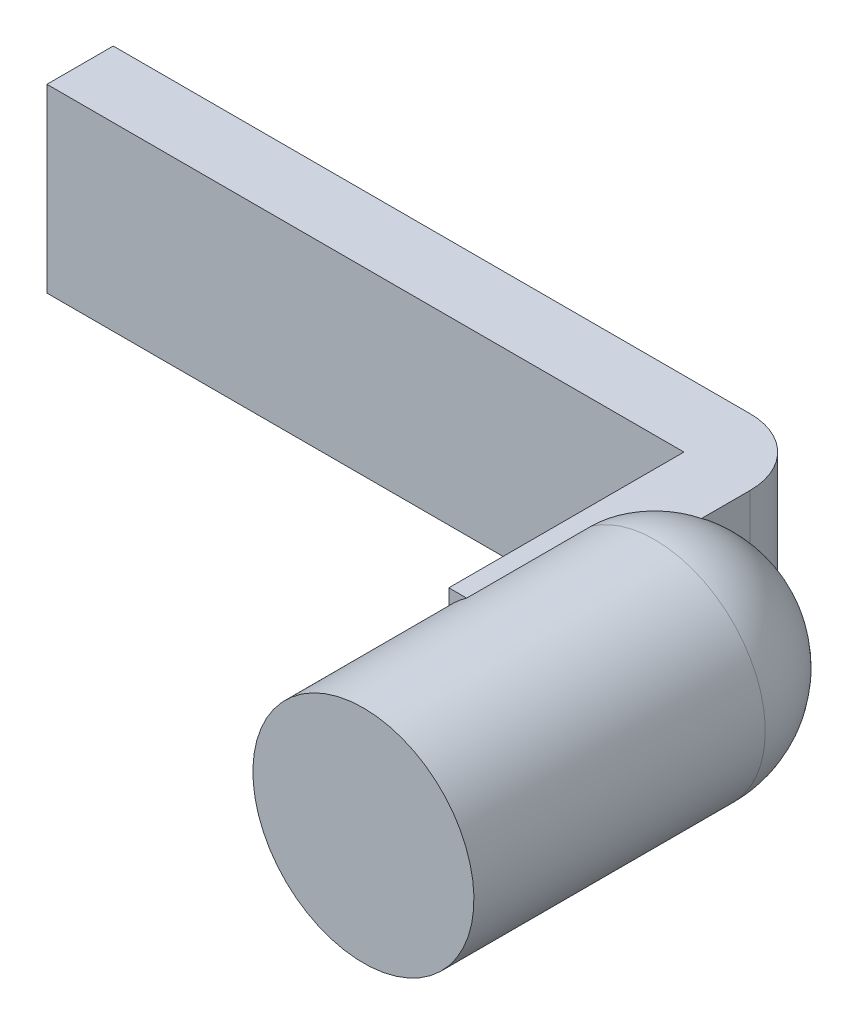
ISO-10303-21;
HEADER;
FILE_DESCRIPTION(('STEP AP214'),'2;1');
FILE_NAME('part.step','',(''),(''),'','','');
FILE_SCHEMA(('AUTOMOTIVE_DESIGN { 1 0 10303 214 1 1 1 1 }'));
ENDSEC;
DATA;
#1=APPLICATION_CONTEXT('core data for automotive mechanical design processes');
#2=APPLICATION_PROTOCOL_DEFINITION('international standard','automotive_design',2000,#1);
#3=PRODUCT_CONTEXT('',#1,'mechanical');
#4=PRODUCT('Part','Part','',(#3));
#5=PRODUCT_RELATED_PRODUCT_CATEGORY('part','',(#4));
#6=PRODUCT_DEFINITION_FORMATION('','',#4);
#7=PRODUCT_DEFINITION_CONTEXT('part definition',#1,'design');
#8=PRODUCT_DEFINITION('design','',#6,#7);
#9=PRODUCT_DEFINITION_SHAPE('','',#8);
#10=(LENGTH_UNIT() NAMED_UNIT(*) SI_UNIT(.MILLI.,.METRE.));
#11=(NAMED_UNIT(*) PLANE_ANGLE_UNIT() SI_UNIT($,.RADIAN.));
#12=(NAMED_UNIT(*) SI_UNIT($,.STERADIAN.) SOLID_ANGLE_UNIT());
#13=UNCERTAINTY_MEASURE_WITH_UNIT(LENGTH_MEASURE(1.E-05),#10,'distance_accuracy_value','');
#14=(GEOMETRIC_REPRESENTATION_CONTEXT(3) GLOBAL_UNCERTAINTY_ASSIGNED_CONTEXT((#13)) GLOBAL_UNIT_ASSIGNED_CONTEXT((#10,
#11,#12)) REPRESENTATION_CONTEXT('',''));
#15=CARTESIAN_POINT('',(0.,0.,0.));
#16=DIRECTION('',(0.,0.,1.));
#17=DIRECTION('',(1.,0.,0.));
#18=AXIS2_PLACEMENT_3D('',#15,#16,#17);
#19=CARTESIAN_POINT('',(-2.275,0.,0.705));
#20=DIRECTION('',(0.,0.,-1.));
#21=DIRECTION('',(0.,1.,0.));
#22=AXIS2_PLACEMENT_3D('',#19,#20,#21);
#23=CYLINDRICAL_SURFACE('',#22,0.55);
#24=CARTESIAN_POINT('',(-2.275,0.,1.43));
#25=DIRECTION('',(0.,0.,-1.));
#26=DIRECTION('',(0.,1.,0.));
#27=AXIS2_PLACEMENT_3D('',#24,#25,#26);
#28=CIRCLE('',#27,0.55);
#29=CARTESIAN_POINT('',(-2.275,0.55,1.43));
#30=VERTEX_POINT('',#29);
#31=EDGE_CURVE('E30',#30,#30,#28,.T.);
#32=ORIENTED_EDGE('',*,*,#31,.T.);
#33=CARTESIAN_POINT('',(-2.275,0.55,1.43));
#34=CARTESIAN_POINT('',(-2.275,0.55,-0.02000000000001));
#35=(BOUNDED_CURVE() B_SPLINE_CURVE(1,(#33,#34),.UNSPECIFIED.,.F.,
.F.) B_SPLINE_CURVE_WITH_KNOTS((2,2),(-0.725,0.725),
.UNSPECIFIED.) CURVE() GEOMETRIC_REPRESENTATION_ITEM() RATIONAL_B_SPLINE_CURVE((1.,1.)) REPRESENTATION_ITEM(''));
#36=CARTESIAN_POINT('',(-2.275,0.55,-0.02000000000001));
#37=VERTEX_POINT('',#36);
#38=EDGE_CURVE('E11',#30,#37,#35,.T.);
#39=ORIENTED_EDGE('',*,*,#38,.T.);
#40=CARTESIAN_POINT('',(-2.275,0.,-0.02));
#41=DIRECTION('',(0.,0.,1.));
#42=DIRECTION('',(0.,1.,0.));
#43=AXIS2_PLACEMENT_3D('',#40,#41,#42);
#44=CIRCLE('',#43,0.55);
#45=CARTESIAN_POINT('',(-2.591227766017,0.45,-0.02000000000001));
#46=VERTEX_POINT('',#45);
#47=EDGE_CURVE('E67',#37,#46,#44,.T.);
#48=ORIENTED_EDGE('',*,*,#47,.T.);
#49=DIRECTION('',(0.,0.,-1.));
#50=VECTOR('',#49,1.);
#51=CARTESIAN_POINT('',(-2.591227766017,0.45,-0.52089));
#52=LINE('',#51,#50);
#53=CARTESIAN_POINT('',(-2.591227766017,0.45,0.6));
#54=VERTEX_POINT('',#53);
#55=EDGE_CURVE('E253',#54,#46,#52,.T.);
#56=ORIENTED_EDGE('',*,*,#55,.F.);
#57=CARTESIAN_POINT('',(-2.275,0.,0.6));
#58=DIRECTION('',(0.,0.,1.));
#59=DIRECTION('',(0.,1.,0.));
#60=AXIS2_PLACEMENT_3D('',#57,#58,#59);
#61=CIRCLE('',#60,0.55);
#62=CARTESIAN_POINT('',(-2.68,0.372122291727,0.6));
#63=VERTEX_POINT('',#62);
#64=EDGE_CURVE('E220',#54,#63,#61,.T.);
#65=ORIENTED_EDGE('',*,*,#64,.T.);
#66=DIRECTION('',(0.,0.,-1.));
#67=VECTOR('',#66,1.);
#68=CARTESIAN_POINT('',(-2.68,0.372122291727,0.705));
#69=LINE('',#68,#67);
#70=CARTESIAN_POINT('',(-2.68,0.372122291727,-0.02000000000001));
#71=VERTEX_POINT('',#70);
#72=EDGE_CURVE('E229',#63,#71,#69,.T.);
#73=ORIENTED_EDGE('',*,*,#72,.T.);
#74=CARTESIAN_POINT('',(-2.275,0.,-0.02));
#75=DIRECTION('',(0.,0.,1.));
#76=DIRECTION('',(0.,1.,0.));
#77=AXIS2_PLACEMENT_3D('',#74,#75,#76);
#78=CIRCLE('',#77,0.55);
#79=CARTESIAN_POINT('',(-2.68,-0.372122291727,-0.02));
#80=VERTEX_POINT('',#79);
#81=EDGE_CURVE('E224',#71,#80,#78,.T.);
#82=ORIENTED_EDGE('',*,*,#81,.T.);
#83=DIRECTION('',(0.,0.,1.));
#84=VECTOR('',#83,1.);
#85=CARTESIAN_POINT('',(-2.68,-0.372122291727,0.705));
#86=LINE('',#85,#84);
#87=CARTESIAN_POINT('',(-2.68,-0.372122291727,0.6));
#88=VERTEX_POINT('',#87);
#89=EDGE_CURVE('E225',#80,#88,#86,.T.);
#90=ORIENTED_EDGE('',*,*,#89,.T.);
#91=CARTESIAN_POINT('',(-2.275,0.,0.6));
#92=DIRECTION('',(0.,0.,1.));
#93=DIRECTION('',(0.,1.,0.));
#94=AXIS2_PLACEMENT_3D('',#91,#92,#93);
#95=CIRCLE('',#94,0.55);
#96=CARTESIAN_POINT('',(-2.591227766017,-0.45,0.6));
#97=VERTEX_POINT('',#96);
#98=EDGE_CURVE('E233',#88,#97,#95,.T.);
#99=ORIENTED_EDGE('',*,*,#98,.T.);
#100=DIRECTION('',(0.,0.,-1.));
#101=VECTOR('',#100,1.);
#102=CARTESIAN_POINT('',(-2.591227766017,-0.45,0.705));
#103=LINE('',#102,#101);
#104=CARTESIAN_POINT('',(-2.591227766017,-0.45,-0.02));
#105=VERTEX_POINT('',#104);
#106=EDGE_CURVE('E254',#97,#105,#103,.T.);
#107=ORIENTED_EDGE('',*,*,#106,.T.);
#108=CARTESIAN_POINT('',(-2.275,0.,-0.02));
#109=DIRECTION('',(0.,0.,-1.));
#110=DIRECTION('',(0.,1.,0.));
#111=AXIS2_PLACEMENT_3D('',#108,#109,#110);
#112=CIRCLE('',#111,0.55);
#113=CARTESIAN_POINT('',(-2.275,-0.55,-0.02));
#114=VERTEX_POINT('',#113);
#115=EDGE_CURVE('E150',#114,#105,#112,.T.);
#116=ORIENTED_EDGE('',*,*,#115,.F.);
#117=CARTESIAN_POINT('',(-2.275,0.,-0.02));
#118=DIRECTION('',(0.,0.,1.));
#119=DIRECTION('',(0.,1.,0.));
#120=AXIS2_PLACEMENT_3D('',#117,#118,#119);
#121=CIRCLE('',#120,0.55);
#122=EDGE_CURVE('E199',#114,#37,#121,.T.);
#123=ORIENTED_EDGE('',*,*,#122,.T.);
#124=ORIENTED_EDGE('',*,*,#38,.F.);
#125=EDGE_LOOP('',(#32,#39,#48,#56,#65,#73,#82,#90,#99,#107,#116,#123,#124));
#126=FACE_BOUND('',#125,.T.);
#127=ADVANCED_FACE('F17',(#126),#23,.T.);
#128=CARTESIAN_POINT('',(-1.725,0.,1.43));
#129=DIRECTION('',(0.,0.,1.));
#130=DIRECTION('',(0.,-1.,0.));
#131=AXIS2_PLACEMENT_3D('',#128,#129,#130);
#132=PLANE('',#131);
#133=ORIENTED_EDGE('',*,*,#31,.F.);
#134=EDGE_LOOP('',(#133));
#135=FACE_BOUND('',#134,.T.);
#136=ADVANCED_FACE('F272',(#135),#132,.T.);
#137=CARTESIAN_POINT('',(-2.35,0.,0.6));
#138=DIRECTION('',(0.,0.,1.));
#139=DIRECTION('',(0.,-1.,0.));
#140=AXIS2_PLACEMENT_3D('',#137,#138,#139);
#141=PLANE('',#140);
#142=DIRECTION('',(0.,-1.,0.));
#143=VECTOR('',#142,1.);
#144=CARTESIAN_POINT('',(-2.68,0.,0.6));
#145=LINE('',#144,#143);
#146=CARTESIAN_POINT('',(-2.68,-0.45,0.6));
#147=VERTEX_POINT('',#146);
#148=EDGE_CURVE('E142',#88,#147,#145,.T.);
#149=ORIENTED_EDGE('',*,*,#148,.T.);
#150=DIRECTION('',(1.,0.,0.));
#151=VECTOR('',#150,1.);
#152=CARTESIAN_POINT('',(-2.35,-0.45,0.6));
#153=LINE('',#152,#151);
#154=EDGE_CURVE('E207',#147,#97,#153,.T.);
#155=ORIENTED_EDGE('',*,*,#154,.T.);
#156=ORIENTED_EDGE('',*,*,#98,.F.);
#157=EDGE_LOOP('',(#149,#155,#156));
#158=FACE_BOUND('',#157,.T.);
#159=ADVANCED_FACE('F275',(#158),#141,.T.);
#160=CARTESIAN_POINT('',(-2.68,0.,0.6));
#161=DIRECTION('',(-1.,0.,0.));
#162=DIRECTION('',(0.,1.,0.));
#163=AXIS2_PLACEMENT_3D('',#160,#161,#162);
#164=PLANE('',#163);
#165=DIRECTION('',(0.,0.,1.));
#166=VECTOR('',#165,1.);
#167=CARTESIAN_POINT('',(-2.68,-0.45,0.6));
#168=LINE('',#167,#166);
#169=CARTESIAN_POINT('',(-2.68,-0.45,-0.57));
#170=VERTEX_POINT('',#169);
#171=EDGE_CURVE('E204',#170,#147,#168,.T.);
#172=ORIENTED_EDGE('',*,*,#171,.T.);
#173=ORIENTED_EDGE('',*,*,#148,.F.);
#174=ORIENTED_EDGE('',*,*,#89,.F.);
#175=CARTESIAN_POINT('',(-2.68,-0.372122291727,-0.02));
#176=CARTESIAN_POINT('',(-2.68,-0.372122291727,-0.04112449996238));
#177=CARTESIAN_POINT('',(-2.68,-0.37033672664,-0.06194491303894));
#178=CARTESIAN_POINT('',(-2.68,-0.363344399046,-0.103003099401));
#179=CARTESIAN_POINT('',(-2.68,-0.358137636539,-0.123240872687));
#180=CARTESIAN_POINT('',(-2.68,-0.344152981351,-0.163108245486));
#181=CARTESIAN_POINT('',(-2.68,-0.335576397589,-0.182163954717));
#182=CARTESIAN_POINT('',(-2.68,-0.315387746701,-0.218593142024));
#183=CARTESIAN_POINT('',(-2.68,-0.303775679576,-0.2359666201));
#184=CARTESIAN_POINT('',(-2.68,-0.277383032988,-0.268957621914));
#185=CARTESIAN_POINT('',(-2.68,-0.26298237531,-0.284100240637));
#186=CARTESIAN_POINT('',(-2.68,-0.231873518371,-0.311793314362));
#187=CARTESIAN_POINT('',(-2.68,-0.215165319109,-0.324343769365));
#188=CARTESIAN_POINT('',(-2.68,-0.179340251817,-0.346738915002));
#189=CARTESIAN_POINT('',(-2.68,-0.160739085137,-0.356261227824));
#190=CARTESIAN_POINT('',(-2.68,-0.122217309781,-0.372096003979));
#191=CARTESIAN_POINT('',(-2.68,-0.102296701106,-0.378408467313));
#192=CARTESIAN_POINT('',(-2.68,-0.06107821768609,-0.387682873986));
#193=CARTESIAN_POINT('',(-2.68,-0.04037368244261,-0.39051131237));
#194=CARTESIAN_POINT('',(-2.68,0.001217973374873,-0.392702540062));
#195=CARTESIAN_POINT('',(-2.68,0.02210509394888,-0.392065329371));
#196=CARTESIAN_POINT('',(-2.68,0.06406992216426,-0.387173378082));
#197=CARTESIAN_POINT('',(-2.68,0.08454354668184,-0.382989057056));
#198=CARTESIAN_POINT('',(-2.68,0.124515939272,-0.371289691986));
#199=CARTESIAN_POINT('',(-2.68,0.144014707345,-0.363774647941));
#200=CARTESIAN_POINT('',(-2.68,0.18199466431,-0.345267869089));
#201=CARTESIAN_POINT('',(-2.68,0.199929132245,-0.334542539107));
#202=CARTESIAN_POINT('',(-2.68,0.233775677564,-0.310271595936));
#203=CARTESIAN_POINT('',(-2.68,0.249687754948,-0.296725982748));
#204=CARTESIAN_POINT('',(-2.68,0.279400888622,-0.266690875259));
#205=CARTESIAN_POINT('',(-2.68,0.292774224762,-0.250633735918));
#206=CARTESIAN_POINT('',(-2.68,0.316678981577,-0.216527579376));
#207=CARTESIAN_POINT('',(-2.68,0.327210402253,-0.198478562176));
#208=CARTESIAN_POINT('',(-2.68,0.34530678221,-0.160301356581));
#209=CARTESIAN_POINT('',(-2.68,0.352611244351,-0.140722728535));
#210=CARTESIAN_POINT('',(-2.68,0.363879132668,-0.100626569052));
#211=CARTESIAN_POINT('',(-2.68,0.367842558842,-0.08010903761419));
#212=CARTESIAN_POINT('',(-2.68,0.370748935362,-0.05260265602304));
#213=CARTESIAN_POINT('',(-2.68,0.371263587125,-0.04609476802498));
#214=CARTESIAN_POINT('',(-2.68,0.371950265307,-0.03306094104902));
#215=CARTESIAN_POINT('',(-2.68,0.372122291727,-0.02653500207113));
#216=CARTESIAN_POINT('',(-2.68,0.372122291727,-0.02000000000001));
#217=(BOUNDED_CURVE() B_SPLINE_CURVE(3,(#175,#176,#177,#178,#179,#180,#181,#182,#183,#184,#185,
#186,#187,#188,#189,#190,#191,#192,#193,#194,#195,#196,#197,#198,#199,#200,#201,#202,#203,#204,
#205,#206,#207,#208,#209,#210,#211,#212,#213,#214,#215,#216),.UNSPECIFIED.,.F.,
.F.) B_SPLINE_CURVE_WITH_KNOTS((4,2,2,2,2,2,2,2,2,2,2,2,2,2,2,2,2,2,2,2,4),(0.,0.06247400621997,
0.12494801244,0.18742201866,0.24989602488,0.312370031098,0.374844037317,0.437318043536,
0.499792049754,0.562266055973,0.624740062191,0.68721406841,0.749688074628,0.812162080847,
0.874636087065,0.937110093284,0.999584099502,1.062058105721,1.124532111939,1.14385885391,
1.163185595881),
.UNSPECIFIED.) CURVE() GEOMETRIC_REPRESENTATION_ITEM() RATIONAL_B_SPLINE_CURVE((1.,1.,1.,1.,1.,
1.,1.,1.,1.,1.,1.,1.,1.,1.,1.,1.,1.,1.,1.,1.,1.,1.,1.,1.,1.,1.,1.,1.,1.,1.,1.,1.,1.,1.,1.,1.,1.,
1.,1.,1.,1.,1.)) REPRESENTATION_ITEM(''));
#218=EDGE_CURVE('E356',#80,#71,#217,.T.);
#219=ORIENTED_EDGE('',*,*,#218,.T.);
#220=ORIENTED_EDGE('',*,*,#72,.F.);
#221=DIRECTION('',(0.,1.,0.));
#222=VECTOR('',#221,1.);
#223=CARTESIAN_POINT('',(-2.68,0.,0.6));
#224=LINE('',#223,#222);
#225=CARTESIAN_POINT('',(-2.68,0.45,0.6));
#226=VERTEX_POINT('',#225);
#227=EDGE_CURVE('E217',#63,#226,#224,.T.);
#228=ORIENTED_EDGE('',*,*,#227,.T.);
#229=DIRECTION('',(0.,0.,1.));
#230=VECTOR('',#229,1.);
#231=CARTESIAN_POINT('',(-2.68,0.45,-0.52089));
#232=LINE('',#231,#230);
#233=CARTESIAN_POINT('',(-2.68,0.45,-0.57));
#234=VERTEX_POINT('',#233);
#235=EDGE_CURVE('E342',#234,#226,#232,.T.);
#236=ORIENTED_EDGE('',*,*,#235,.F.);
#237=DIRECTION('',(0.,1.,0.));
#238=VECTOR('',#237,1.);
#239=CARTESIAN_POINT('',(-2.68,0.,-0.57));
#240=LINE('',#239,#238);
#241=EDGE_CURVE('E210',#170,#234,#240,.T.);
#242=ORIENTED_EDGE('',*,*,#241,.F.);
#243=EDGE_LOOP('',(#172,#173,#174,#219,#220,#228,#236,#242));
#244=FACE_BOUND('',#243,.T.);
#245=ADVANCED_FACE('F270',(#244),#164,.T.);
#246=CARTESIAN_POINT('',(-2.67666557923296,0.375718994009386,-0.0200000000000014));
#247=CARTESIAN_POINT('',(-2.88528379004761,0.152693925217389,-0.0200000000000005));
#248=CARTESIAN_POINT('',(-2.88528379004762,-0.152693925217401,-0.0199999999999995));
#249=CARTESIAN_POINT('',(-2.67666557923299,-0.375718994009417,-0.0199999999999987));
#250=(BOUNDED_CURVE() B_SPLINE_CURVE(3,(#246,#247,#248,#249),.UNSPECIFIED.,.F.,
.F.) B_SPLINE_CURVE_WITH_KNOTS((4,4),(0.,1.),
.UNSPECIFIED.) CURVE() GEOMETRIC_REPRESENTATION_ITEM() RATIONAL_B_SPLINE_CURVE((1.,
0.820200702100579,0.820200702100579,1.)) REPRESENTATION_ITEM(''));
#251=CARTESIAN_POINT('',(-2.275,0.,-0.02));
#252=DIRECTION('',(0.,-1.,0.));
#253=AXIS1_PLACEMENT('',#251,#252);
#254=SURFACE_OF_REVOLUTION('',#250,#253);
#255=ORIENTED_EDGE('',*,*,#81,.F.);
#256=ORIENTED_EDGE('',*,*,#218,.F.);
#257=EDGE_LOOP('',(#255,#256));
#258=FACE_BOUND('',#257,.T.);
#259=ADVANCED_FACE('F266',(#258),#254,.T.);
#260=CARTESIAN_POINT('',(-2.35,0.,0.6));
#261=DIRECTION('',(0.,0.,1.));
#262=DIRECTION('',(0.,-1.,0.));
#263=AXIS2_PLACEMENT_3D('',#260,#261,#262);
#264=PLANE('',#263);
#265=DIRECTION('',(1.,0.,0.));
#266=VECTOR('',#265,1.);
#267=CARTESIAN_POINT('',(-3.72911,0.45,0.6));
#268=LINE('',#267,#266);
#269=EDGE_CURVE('E323',#226,#54,#268,.T.);
#270=ORIENTED_EDGE('',*,*,#269,.F.);
#271=ORIENTED_EDGE('',*,*,#227,.F.);
#272=ORIENTED_EDGE('',*,*,#64,.F.);
#273=EDGE_LOOP('',(#270,#271,#272));
#274=FACE_BOUND('',#273,.T.);
#275=ADVANCED_FACE('F269',(#274),#264,.T.);
#276=CARTESIAN_POINT('',(-2.275,0.549999999999966,-0.020000000000002));
#277=CARTESIAN_POINT('',(-3.375,0.549999999999951,-0.0200000000000019));
#278=CARTESIAN_POINT('',(-3.375,-0.55000000000005,-0.019999999999998));
#279=CARTESIAN_POINT('',(-2.275,-0.550000000000035,-0.0199999999999981));
#280=(BOUNDED_CURVE() B_SPLINE_CURVE(3,(#276,#277,#278,#279),.UNSPECIFIED.,.F.,
.F.) B_SPLINE_CURVE_WITH_KNOTS((4,4),(0.,1.),
.UNSPECIFIED.) CURVE() GEOMETRIC_REPRESENTATION_ITEM() RATIONAL_B_SPLINE_CURVE((1.,
0.333333333333334,0.333333333333334,1.)) REPRESENTATION_ITEM(''));
#281=CARTESIAN_POINT('',(-2.275,0.,-0.02));
#282=DIRECTION('',(0.,-1.,0.));
#283=AXIS1_PLACEMENT('',#281,#282);
#284=SURFACE_OF_REVOLUTION('',#280,#283);
#285=ORIENTED_EDGE('',*,*,#122,.F.);
#286=ORIENTED_EDGE('',*,*,#115,.T.);
#287=CARTESIAN_POINT('',(-2.275,-0.45,-0.02));
#288=DIRECTION('',(0.,-1.,0.));
#289=DIRECTION('',(0.,0.,1.));
#290=AXIS2_PLACEMENT_3D('',#287,#288,#289);
#291=CIRCLE('',#290,0.316227766017);
#292=CARTESIAN_POINT('',(-2.35,-0.45,-0.327205143186));
#293=VERTEX_POINT('',#292);
#294=EDGE_CURVE('E159',#105,#293,#291,.T.);
#295=ORIENTED_EDGE('',*,*,#294,.T.);
#296=CARTESIAN_POINT('',(-2.35,-0.45,-0.327205143186));
#297=CARTESIAN_POINT('',(-2.35,-0.432560692601,-0.352750575949));
#298=CARTESIAN_POINT('',(-2.35,-0.413213175859,-0.376454211292));
#299=CARTESIAN_POINT('',(-2.35,-0.370861954802,-0.420332541684));
#300=CARTESIAN_POINT('',(-2.35,-0.347858250487,-0.440507236734));
#301=CARTESIAN_POINT('',(-2.35,-0.298034423171,-0.477173031994));
#302=CARTESIAN_POINT('',(-2.35,-0.271931513478,-0.493136328587));
#303=CARTESIAN_POINT('',(-2.35,-0.217443709193,-0.520522693575));
#304=CARTESIAN_POINT('',(-2.35,-0.189058814601,-0.53194576197));
#305=CARTESIAN_POINT('',(-2.35,-0.129907033346,-0.550052696687));
#306=CARTESIAN_POINT('',(-2.349999999964,-0.09999163579467,-0.556475914205));
#307=CARTESIAN_POINT('',(-2.349999999964,-0.03951033488424,-0.56428270889));
#308=CARTESIAN_POINT('',(-2.35,-0.008944431523461,-0.565666286042));
#309=CARTESIAN_POINT('',(-2.35,0.05286638904479,-0.56317294068));
#310=CARTESIAN_POINT('',(-2.349999999957,0.08322154045112,-0.559331909902));
#311=CARTESIAN_POINT('',(-2.349999999957,0.142877530104,-0.546678977374));
#312=CARTESIAN_POINT('',(-2.35,0.172178368358,-0.537867075655));
#313=CARTESIAN_POINT('',(-2.35,0.229679527103,-0.515054555991));
#314=CARTESIAN_POINT('',(-2.35,0.257052119137,-0.501382323624));
#315=CARTESIAN_POINT('',(-2.35,0.309157037241,-0.46969618608));
#316=CARTESIAN_POINT('',(-2.35,0.333889363311,-0.451682280903));
#317=CARTESIAN_POINT('',(-2.35,0.374944677623,-0.416031656698));
#318=CARTESIAN_POINT('',(-2.35,0.391510967118,-0.399650813773));
#319=CARTESIAN_POINT('',(-2.35,0.422429733104,-0.364918393771));
#320=CARTESIAN_POINT('',(-2.35,0.436782209594,-0.346566816695));
#321=CARTESIAN_POINT('',(-2.35,0.45,-0.327205143186));
#322=(BOUNDED_CURVE() B_SPLINE_CURVE(3,(#296,#297,#298,#299,#300,#301,#302,#303,#304,#305,#306,
#307,#308,#309,#310,#311,#312,#313,#314,#315,#316,#317,#318,#319,#320,#321),.UNSPECIFIED.,.F.,
.F.) B_SPLINE_CURVE_WITH_KNOTS((4,2,2,2,2,2,2,2,2,2,2,2,4),(0.,0.09147459241185,0.182949184824,
0.274423777236,0.365898369647,0.457372962059,0.548847554471,0.640322146883,0.731796739295,
0.823271331707,0.914745924119,0.984077346649,1.053408769179),
.UNSPECIFIED.) CURVE() GEOMETRIC_REPRESENTATION_ITEM() RATIONAL_B_SPLINE_CURVE((1.,1.,1.,1.,1.,
1.,1.,1.,1.,1.,1.,1.,1.,1.,1.,1.,1.,1.,1.,1.,1.,1.,1.,1.,1.,1.)) REPRESENTATION_ITEM(''));
#323=CARTESIAN_POINT('',(-2.35,0.45,-0.327205143186));
#324=VERTEX_POINT('',#323);
#325=EDGE_CURVE('E80',#293,#324,#322,.T.);
#326=ORIENTED_EDGE('',*,*,#325,.T.);
#327=CARTESIAN_POINT('',(-2.275,0.45,-0.02000000000001));
#328=DIRECTION('',(0.,-1.,0.));
#329=DIRECTION('',(0.,0.,1.));
#330=AXIS2_PLACEMENT_3D('',#327,#328,#329);
#331=CIRCLE('',#330,0.316227766017);
#332=EDGE_CURVE('E216',#46,#324,#331,.T.);
#333=ORIENTED_EDGE('',*,*,#332,.F.);
#334=ORIENTED_EDGE('',*,*,#47,.F.);
#335=EDGE_LOOP('',(#285,#286,#295,#326,#333,#334));
#336=FACE_BOUND('',#335,.T.);
#337=ADVANCED_FACE('F19',(#336),#284,.T.);
#338=CARTESIAN_POINT('',(-3.72911,-0.45,-0.52089));
#339=DIRECTION('',(0.,-1.,0.));
#340=DIRECTION('',(0.,0.,-1.));
#341=AXIS2_PLACEMENT_3D('',#338,#339,#340);
#342=PLANE('',#341);
#343=DIRECTION('',(0.,0.,-1.));
#344=VECTOR('',#343,1.);
#345=CARTESIAN_POINT('',(-5.85,-0.45,-0.52089));
#346=LINE('',#345,#344);
#347=CARTESIAN_POINT('',(-5.85,-0.45,-0.57));
#348=VERTEX_POINT('',#347);
#349=CARTESIAN_POINT('',(-5.85,-0.45,-0.9));
#350=VERTEX_POINT('',#349);
#351=EDGE_CURVE('E172',#348,#350,#346,.T.);
#352=ORIENTED_EDGE('',*,*,#351,.T.);
#353=DIRECTION('',(1.,0.,0.));
#354=VECTOR('',#353,1.);
#355=CARTESIAN_POINT('',(-3.72911,-0.45,-0.9));
#356=LINE('',#355,#354);
#357=CARTESIAN_POINT('',(-2.68,-0.45,-0.9));
#358=VERTEX_POINT('',#357);
#359=EDGE_CURVE('E102',#350,#358,#356,.T.);
#360=ORIENTED_EDGE('',*,*,#359,.T.);
#361=CARTESIAN_POINT('',(-2.68,-0.45,-0.57));
#362=DIRECTION('',(0.,-1.,0.));
#363=DIRECTION('',(1.,0.,0.));
#364=AXIS2_PLACEMENT_3D('',#361,#362,#363);
#365=CIRCLE('',#364,0.33);
#366=CARTESIAN_POINT('',(-2.35,-0.45,-0.57));
#367=VERTEX_POINT('',#366);
#368=EDGE_CURVE('E211',#358,#367,#365,.T.);
#369=ORIENTED_EDGE('',*,*,#368,.T.);
#370=DIRECTION('',(0.,0.,1.));
#371=VECTOR('',#370,1.);
#372=CARTESIAN_POINT('',(-2.35,-0.45,-0.52089));
#373=LINE('',#372,#371);
#374=EDGE_CURVE('E116',#367,#293,#373,.T.);
#375=ORIENTED_EDGE('',*,*,#374,.T.);
#376=ORIENTED_EDGE('',*,*,#294,.F.);
#377=ORIENTED_EDGE('',*,*,#106,.F.);
#378=ORIENTED_EDGE('',*,*,#154,.F.);
#379=ORIENTED_EDGE('',*,*,#171,.F.);
#380=DIRECTION('',(-1.,0.,0.));
#381=VECTOR('',#380,1.);
#382=CARTESIAN_POINT('',(-3.72911,-0.45,-0.57));
#383=LINE('',#382,#381);
#384=EDGE_CURVE('E177',#170,#348,#383,.T.);
#385=ORIENTED_EDGE('',*,*,#384,.T.);
#386=EDGE_LOOP('',(#352,#360,#369,#375,#376,#377,#378,#379,#385));
#387=FACE_BOUND('',#386,.T.);
#388=ADVANCED_FACE('F175',(#387),#342,.T.);
#389=CARTESIAN_POINT('',(-2.35,0.,-0.9));
#390=DIRECTION('',(1.,0.,0.));
#391=DIRECTION('',(0.,1.,0.));
#392=AXIS2_PLACEMENT_3D('',#389,#390,#391);
#393=PLANE('',#392);
#394=ORIENTED_EDGE('',*,*,#325,.F.);
#395=ORIENTED_EDGE('',*,*,#374,.F.);
#396=DIRECTION('',(0.,1.,0.));
#397=VECTOR('',#396,1.);
#398=CARTESIAN_POINT('',(-2.35,0.,-0.57));
#399=LINE('',#398,#397);
#400=CARTESIAN_POINT('',(-2.35,0.45,-0.57));
#401=VERTEX_POINT('',#400);
#402=EDGE_CURVE('E250',#367,#401,#399,.T.);
#403=ORIENTED_EDGE('',*,*,#402,.T.);
#404=DIRECTION('',(0.,0.,-1.));
#405=VECTOR('',#404,1.);
#406=CARTESIAN_POINT('',(-2.35,0.45,-0.52089));
#407=LINE('',#406,#405);
#408=EDGE_CURVE('E212',#324,#401,#407,.T.);
#409=ORIENTED_EDGE('',*,*,#408,.F.);
#410=EDGE_LOOP('',(#394,#395,#403,#409));
#411=FACE_BOUND('',#410,.T.);
#412=ADVANCED_FACE('F279',(#411),#393,.T.);
#413=CARTESIAN_POINT('',(-5.85,0.,-0.9));
#414=DIRECTION('',(0.,0.,-1.));
#415=DIRECTION('',(0.,-1.,0.));
#416=AXIS2_PLACEMENT_3D('',#413,#414,#415);
#417=PLANE('',#416);
#418=DIRECTION('',(0.,1.,0.));
#419=VECTOR('',#418,1.);
#420=CARTESIAN_POINT('',(-5.85,0.,-0.9));
#421=LINE('',#420,#419);
#422=CARTESIAN_POINT('',(-5.85,0.45,-0.9));
#423=VERTEX_POINT('',#422);
#424=EDGE_CURVE('E166',#350,#423,#421,.T.);
#425=ORIENTED_EDGE('',*,*,#424,.T.);
#426=DIRECTION('',(1.,0.,0.));
#427=VECTOR('',#426,1.);
#428=CARTESIAN_POINT('',(-5.85,0.45,-0.9));
#429=LINE('',#428,#427);
#430=CARTESIAN_POINT('',(-2.68,0.45,-0.9));
#431=VERTEX_POINT('',#430);
#432=EDGE_CURVE('E203',#423,#431,#429,.T.);
#433=ORIENTED_EDGE('',*,*,#432,.T.);
#434=DIRECTION('',(0.,-1.,0.));
#435=VECTOR('',#434,1.);
#436=CARTESIAN_POINT('',(-2.68,0.,-0.9));
#437=LINE('',#436,#435);
#438=EDGE_CURVE('E169',#431,#358,#437,.T.);
#439=ORIENTED_EDGE('',*,*,#438,.T.);
#440=ORIENTED_EDGE('',*,*,#359,.F.);
#441=EDGE_LOOP('',(#425,#433,#439,#440));
#442=FACE_BOUND('',#441,.T.);
#443=ADVANCED_FACE('F163',(#442),#417,.T.);
#444=CARTESIAN_POINT('',(-5.85,0.,-0.57));
#445=DIRECTION('',(-1.,0.,0.));
#446=DIRECTION('',(0.,1.,0.));
#447=AXIS2_PLACEMENT_3D('',#444,#445,#446);
#448=PLANE('',#447);
#449=DIRECTION('',(0.,1.,0.));
#450=VECTOR('',#449,1.);
#451=CARTESIAN_POINT('',(-5.85,0.,-0.57));
#452=LINE('',#451,#450);
#453=CARTESIAN_POINT('',(-5.85,0.45,-0.57));
#454=VERTEX_POINT('',#453);
#455=EDGE_CURVE('E192',#348,#454,#452,.T.);
#456=ORIENTED_EDGE('',*,*,#455,.T.);
#457=DIRECTION('',(0.,0.,-1.));
#458=VECTOR('',#457,1.);
#459=CARTESIAN_POINT('',(-5.85,0.45,-0.57));
#460=LINE('',#459,#458);
#461=EDGE_CURVE('E184',#454,#423,#460,.T.);
#462=ORIENTED_EDGE('',*,*,#461,.T.);
#463=ORIENTED_EDGE('',*,*,#424,.F.);
#464=ORIENTED_EDGE('',*,*,#351,.F.);
#465=EDGE_LOOP('',(#456,#462,#463,#464));
#466=FACE_BOUND('',#465,.T.);
#467=ADVANCED_FACE('F182',(#466),#448,.T.);
#468=CARTESIAN_POINT('',(-2.68,0.,-0.57));
#469=DIRECTION('',(0.,0.,1.));
#470=DIRECTION('',(0.,-1.,0.));
#471=AXIS2_PLACEMENT_3D('',#468,#469,#470);
#472=PLANE('',#471);
#473=ORIENTED_EDGE('',*,*,#241,.T.);
#474=DIRECTION('',(-1.,0.,0.));
#475=VECTOR('',#474,1.);
#476=CARTESIAN_POINT('',(-2.68,0.45,-0.57));
#477=LINE('',#476,#475);
#478=EDGE_CURVE('E202',#234,#454,#477,.T.);
#479=ORIENTED_EDGE('',*,*,#478,.T.);
#480=ORIENTED_EDGE('',*,*,#455,.F.);
#481=ORIENTED_EDGE('',*,*,#384,.F.);
#482=EDGE_LOOP('',(#473,#479,#480,#481));
#483=FACE_BOUND('',#482,.T.);
#484=ADVANCED_FACE('F286',(#483),#472,.T.);
#485=CARTESIAN_POINT('',(-2.68,0.,-0.57));
#486=DIRECTION('',(0.,-1.,0.));
#487=DIRECTION('',(1.,0.,0.));
#488=AXIS2_PLACEMENT_3D('',#485,#486,#487);
#489=CYLINDRICAL_SURFACE('',#488,0.33);
#490=CARTESIAN_POINT('',(-2.68,0.45,-0.57));
#491=DIRECTION('',(0.,-1.,0.));
#492=DIRECTION('',(1.,0.,0.));
#493=AXIS2_PLACEMENT_3D('',#490,#491,#492);
#494=CIRCLE('',#493,0.33);
#495=EDGE_CURVE('E196',#431,#401,#494,.T.);
#496=ORIENTED_EDGE('',*,*,#495,.T.);
#497=ORIENTED_EDGE('',*,*,#402,.F.);
#498=ORIENTED_EDGE('',*,*,#368,.F.);
#499=ORIENTED_EDGE('',*,*,#438,.F.);
#500=EDGE_LOOP('',(#496,#497,#498,#499));
#501=FACE_BOUND('',#500,.T.);
#502=ADVANCED_FACE('F287',(#501),#489,.T.);
#503=CARTESIAN_POINT('',(-3.72911,0.45,-0.52089));
#504=DIRECTION('',(0.,1.,0.));
#505=DIRECTION('',(1.,0.,0.));
#506=AXIS2_PLACEMENT_3D('',#503,#504,#505);
#507=PLANE('',#506);
#508=ORIENTED_EDGE('',*,*,#332,.T.);
#509=ORIENTED_EDGE('',*,*,#408,.T.);
#510=ORIENTED_EDGE('',*,*,#495,.F.);
#511=ORIENTED_EDGE('',*,*,#432,.F.);
#512=ORIENTED_EDGE('',*,*,#461,.F.);
#513=ORIENTED_EDGE('',*,*,#478,.F.);
#514=ORIENTED_EDGE('',*,*,#235,.T.);
#515=ORIENTED_EDGE('',*,*,#269,.T.);
#516=ORIENTED_EDGE('',*,*,#55,.T.);
#517=EDGE_LOOP('',(#508,#509,#510,#511,#512,#513,#514,#515,#516));
#518=FACE_BOUND('',#517,.T.);
#519=ADVANCED_FACE('F290',(#518),#507,.T.);
#520=CLOSED_SHELL('',(#127,#136,#159,#245,#259,#275,#337,#388,#412,#443,#467,#484,#502,#519));
#521=MANIFOLD_SOLID_BREP('B1',#520);
#522=ADVANCED_BREP_SHAPE_REPRESENTATION('',(#18,#521),#14);
#523=SHAPE_DEFINITION_REPRESENTATION(#9,#522);
ENDSEC;
END-ISO-10303-21;
